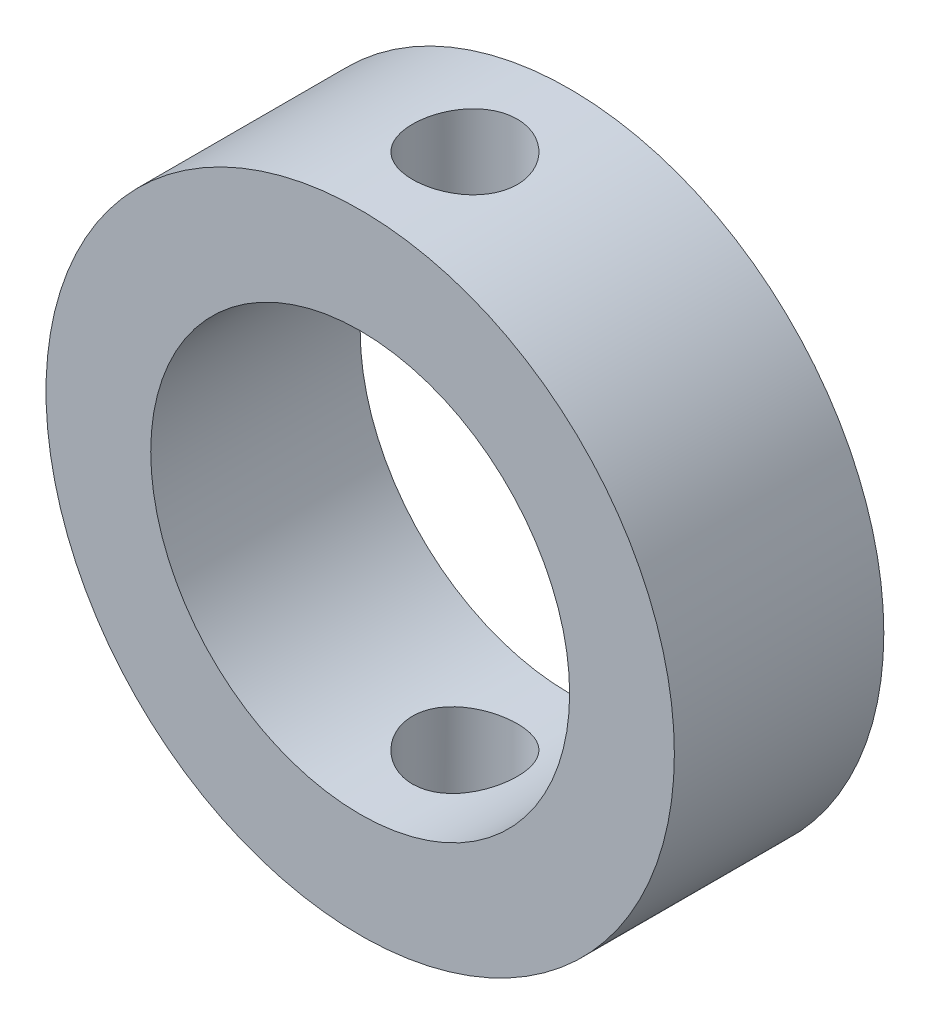
ISO-10303-21;
HEADER;
FILE_DESCRIPTION(('STEP AP214'),'2;1');
FILE_NAME('part.step','',(''),(''),'','','');
FILE_SCHEMA(('AUTOMOTIVE_DESIGN { 1 0 10303 214 1 1 1 1 }'));
ENDSEC;
DATA;
#1=APPLICATION_CONTEXT('core data for automotive mechanical design processes');
#2=APPLICATION_PROTOCOL_DEFINITION('international standard','automotive_design',2000,#1);
#3=PRODUCT_CONTEXT('',#1,'mechanical');
#4=PRODUCT('Part','Part','',(#3));
#5=PRODUCT_RELATED_PRODUCT_CATEGORY('part','',(#4));
#6=PRODUCT_DEFINITION_FORMATION('','',#4);
#7=PRODUCT_DEFINITION_CONTEXT('part definition',#1,'design');
#8=PRODUCT_DEFINITION('design','',#6,#7);
#9=PRODUCT_DEFINITION_SHAPE('','',#8);
#10=(LENGTH_UNIT() NAMED_UNIT(*) SI_UNIT(.MILLI.,.METRE.));
#11=(NAMED_UNIT(*) PLANE_ANGLE_UNIT() SI_UNIT($,.RADIAN.));
#12=(NAMED_UNIT(*) SI_UNIT($,.STERADIAN.) SOLID_ANGLE_UNIT());
#13=UNCERTAINTY_MEASURE_WITH_UNIT(LENGTH_MEASURE(1.E-05),#10,'distance_accuracy_value','');
#14=(GEOMETRIC_REPRESENTATION_CONTEXT(3) GLOBAL_UNCERTAINTY_ASSIGNED_CONTEXT((#13)) GLOBAL_UNIT_ASSIGNED_CONTEXT((#10,
#11,#12)) REPRESENTATION_CONTEXT('',''));
#15=CARTESIAN_POINT('',(0.,0.,0.));
#16=DIRECTION('',(0.,0.,1.));
#17=DIRECTION('',(1.,0.,0.));
#18=AXIS2_PLACEMENT_3D('',#15,#16,#17);
#19=CARTESIAN_POINT('',(0.,0.,10.));
#20=DIRECTION('',(0.,0.,0.999999999999995));
#21=DIRECTION('',(0.999999999999995,0.,0.));
#22=AXIS2_PLACEMENT_3D('',#19,#20,#21);
#23=PLANE('',#22);
#24=CARTESIAN_POINT('',(0.,0.,10.));
#25=DIRECTION('',(0.,0.,0.999999999999995));
#26=DIRECTION('',(0.999999999999995,0.,0.));
#27=AXIS2_PLACEMENT_3D('',#24,#25,#26);
#28=CIRCLE('',#27,15.);
#29=CARTESIAN_POINT('',(14.9999999999999,0.,10.));
#30=VERTEX_POINT('',#29);
#31=EDGE_CURVE('E12',#30,#30,#28,.T.);
#32=ORIENTED_EDGE('',*,*,#31,.T.);
#33=EDGE_LOOP('',(#32));
#34=FACE_BOUND('',#33,.T.);
#35=CARTESIAN_POINT('',(0.,0.,10.));
#36=DIRECTION('',(0.,0.,0.999999999999995));
#37=DIRECTION('',(0.999999999999995,0.,0.));
#38=AXIS2_PLACEMENT_3D('',#35,#36,#37);
#39=CIRCLE('',#38,10.);
#40=CARTESIAN_POINT('',(9.99999999999995,0.,10.));
#41=VERTEX_POINT('',#40);
#42=EDGE_CURVE('E70',#41,#41,#39,.T.);
#43=ORIENTED_EDGE('',*,*,#42,.F.);
#44=EDGE_LOOP('',(#43));
#45=FACE_BOUND('',#44,.T.);
#46=ADVANCED_FACE('F51',(#34,#45),#23,.T.);
#47=CARTESIAN_POINT('',(0.,0.,0.));
#48=DIRECTION('',(0.,0.,0.999999999999995));
#49=DIRECTION('',(0.999999999999995,0.,0.));
#50=AXIS2_PLACEMENT_3D('',#47,#48,#49);
#51=PLANE('',#50);
#52=CARTESIAN_POINT('',(0.,0.,0.));
#53=DIRECTION('',(0.,0.,0.999999999999995));
#54=DIRECTION('',(0.999999999999995,0.,0.));
#55=AXIS2_PLACEMENT_3D('',#52,#53,#54);
#56=CIRCLE('',#55,15.);
#57=CARTESIAN_POINT('',(14.9999999999999,0.,0.));
#58=VERTEX_POINT('',#57);
#59=EDGE_CURVE('E65',#58,#58,#56,.T.);
#60=ORIENTED_EDGE('',*,*,#59,.F.);
#61=EDGE_LOOP('',(#60));
#62=FACE_BOUND('',#61,.T.);
#63=CARTESIAN_POINT('',(0.,0.,0.));
#64=DIRECTION('',(0.,0.,0.999999999999995));
#65=DIRECTION('',(0.999999999999995,0.,0.));
#66=AXIS2_PLACEMENT_3D('',#63,#64,#65);
#67=CIRCLE('',#66,10.);
#68=CARTESIAN_POINT('',(9.99999999999995,0.,0.));
#69=VERTEX_POINT('',#68);
#70=EDGE_CURVE('E73',#69,#69,#67,.T.);
#71=ORIENTED_EDGE('',*,*,#70,.T.);
#72=EDGE_LOOP('',(#71));
#73=FACE_BOUND('',#72,.T.);
#74=ADVANCED_FACE('F109',(#62,#73),#51,.F.);
#75=CARTESIAN_POINT('',(0.,0.,10.));
#76=DIRECTION('',(0.,0.,-0.999999999999995));
#77=DIRECTION('',(-0.999999999999995,0.,0.));
#78=AXIS2_PLACEMENT_3D('',#75,#76,#77);
#79=CYLINDRICAL_SURFACE('',#78,15.);
#80=CARTESIAN_POINT('',(-1.66533453693773E-13,-15.0000000000001,7.50000000000001));
#81=CARTESIAN_POINT('',(0.139390904958074,-14.9999976116884,7.49999441105218));
#82=CARTESIAN_POINT('',(0.278857881838701,-14.9980367791304,7.48830272503107));
#83=CARTESIAN_POINT('',(0.553880221672985,-14.9904034494138,7.44186434123467));
#84=CARTESIAN_POINT('',(0.68943186795923,-14.9847275392389,7.40709644308843));
#85=CARTESIAN_POINT('',(0.952604747212633,-14.9703006823645,7.31558455140724));
#86=CARTESIAN_POINT('',(1.08023236843186,-14.9615522515919,7.25885853435936));
#87=CARTESIAN_POINT('',(1.32414184197791,-14.9419422708207,7.12508770794754));
#88=CARTESIAN_POINT('',(1.4404249898786,-14.9310809625444,7.04804522251701));
#89=CARTESIAN_POINT('',(1.65947261429166,-14.9083331745831,6.87504491617955));
#90=CARTESIAN_POINT('',(1.76211290353487,-14.8964387181486,6.77893088536382));
#91=CARTESIAN_POINT('',(1.9498884986598,-14.8730262687674,6.57085203152713));
#92=CARTESIAN_POINT('',(2.03502269939089,-14.8615082996268,6.45888620854337));
#93=CARTESIAN_POINT('',(2.18586712560504,-14.8400756575979,6.22142903380295));
#94=CARTESIAN_POINT('',(2.25145455286084,-14.8301712909164,6.09585866319523));
#95=CARTESIAN_POINT('',(2.36055836541107,-14.8131978979468,5.83529043569935));
#96=CARTESIAN_POINT('',(2.40407624156555,-14.8061286801433,5.70029321632236));
#97=CARTESIAN_POINT('',(2.46741437778472,-14.7957053684277,5.42601972514346));
#98=CARTESIAN_POINT('',(2.48744902913521,-14.792317684857,5.2867942634986));
#99=CARTESIAN_POINT('',(2.50391672528974,-14.7895393893665,5.00691972311652));
#100=CARTESIAN_POINT('',(2.50035144038902,-14.7901484945724,4.8662707458327));
#101=CARTESIAN_POINT('',(2.46989509839618,-14.7952642886358,4.58907213872457));
#102=CARTESIAN_POINT('',(2.44324488188965,-14.7997307331892,4.4524951964548));
#103=CARTESIAN_POINT('',(2.36775314040325,-14.8119949521101,4.18577868217089));
#104=CARTESIAN_POINT('',(2.31891085431963,-14.819792840733,4.05563933111145));
#105=CARTESIAN_POINT('',(2.20017724609382,-14.8378847933413,3.8047711765591));
#106=CARTESIAN_POINT('',(2.13018591387956,-14.8481906710734,3.68409059391882));
#107=CARTESIAN_POINT('',(1.97121201755731,-14.87012918415,3.45609559946165));
#108=CARTESIAN_POINT('',(1.88222792065426,-14.8817619265428,3.34878226754505));
#109=CARTESIAN_POINT('',(1.68648221215907,-14.9052202787979,3.14917391419265));
#110=CARTESIAN_POINT('',(1.57951396387307,-14.9170464923165,3.05708148146));
#111=CARTESIAN_POINT('',(1.35153524898158,-14.9394260139672,2.89212223733474));
#112=CARTESIAN_POINT('',(1.2305246919064,-14.9499793138975,2.81925554981677));
#113=CARTESIAN_POINT('',(0.977705916166717,-14.9686389289291,2.69479777286369));
#114=CARTESIAN_POINT('',(0.845888725564643,-14.9767431840745,2.64322458066878));
#115=CARTESIAN_POINT('',(0.575298345602703,-14.9895750301266,2.56300578475408));
#116=CARTESIAN_POINT('',(0.436525739179455,-14.9943029035047,2.5343582630263));
#117=CARTESIAN_POINT('',(0.157709901301623,-14.9998112984268,2.50107864153885));
#118=CARTESIAN_POINT('',(0.0177007371510086,-15.0006375301278,2.49616842819438));
#119=CARTESIAN_POINT('',(-0.261139772889886,-14.9983747442117,2.50976134442812));
#120=CARTESIAN_POINT('',(-0.399971163892031,-14.9952858772412,2.52826357313375));
#121=CARTESIAN_POINT('',(-0.671656175546756,-14.985568269382,2.58792484933545));
#122=CARTESIAN_POINT('',(-0.804540868385379,-14.978961048013,2.62894620839004));
#123=CARTESIAN_POINT('',(-1.06154688486041,-14.9629446445537,2.73233451819948));
#124=CARTESIAN_POINT('',(-1.18566771590966,-14.9535353051205,2.79470266763529));
#125=CARTESIAN_POINT('',(-1.42283068946894,-14.9328451630244,2.93965112469679));
#126=CARTESIAN_POINT('',(-1.5357652509372,-14.9215485588703,3.02240515616716));
#127=CARTESIAN_POINT('',(-1.74624358550274,-14.8983846739189,3.20553731538496));
#128=CARTESIAN_POINT('',(-1.84378623969656,-14.8865173517154,3.30591672327667));
#129=CARTESIAN_POINT('',(-2.02174277965802,-14.8634017523585,3.52269754807144));
#130=CARTESIAN_POINT('',(-2.10196876111384,-14.852161161371,3.63925416551435));
#131=CARTESIAN_POINT('',(-2.24170231029511,-14.8317152977788,3.88435296913846));
#132=CARTESIAN_POINT('',(-2.30121053476983,-14.8225099606602,4.01289477522748));
#133=CARTESIAN_POINT('',(-2.39753833147316,-14.807234536977,4.27778973281215));
#134=CARTESIAN_POINT('',(-2.43445143254807,-14.8011515431106,4.41410809503048));
#135=CARTESIAN_POINT('',(-2.48483545377848,-14.7927771683526,4.69112012922174));
#136=CARTESIAN_POINT('',(-2.49830841194635,-14.7904854578274,4.83181341973205));
#137=CARTESIAN_POINT('',(-2.50137286604753,-14.7899673308403,5.11170516596243));
#138=CARTESIAN_POINT('',(-2.49126013612539,-14.7916905650565,5.25090037857531));
#139=CARTESIAN_POINT('',(-2.44807983895697,-14.7988978145372,5.52557924805077));
#140=CARTESIAN_POINT('',(-2.41501234611248,-14.8043818176121,5.66106291694185));
#141=CARTESIAN_POINT('',(-2.32697448959491,-14.8184735628172,5.92435843729262));
#142=CARTESIAN_POINT('',(-2.27202959060057,-14.8270776721967,6.05217901005609));
#143=CARTESIAN_POINT('',(-2.14182700391605,-14.8464436892221,6.29683566919491));
#144=CARTESIAN_POINT('',(-2.06656830874861,-14.857205703884,6.41367121037213));
#145=CARTESIAN_POINT('',(-1.89681888437218,-14.8798345404563,6.63453558310775));
#146=CARTESIAN_POINT('',(-1.80211056359374,-14.891712955763,6.73839601670035));
#147=CARTESIAN_POINT('',(-1.59660903138032,-14.9151437236084,6.92885160447501));
#148=CARTESIAN_POINT('',(-1.48581211291266,-14.9266960002655,7.01544276863818));
#149=CARTESIAN_POINT('',(-1.25036916964028,-14.9482652964222,7.16944826819993));
#150=CARTESIAN_POINT('',(-1.12563278753287,-14.958271162531,7.23672603931299));
#151=CARTESIAN_POINT('',(-0.866513069379078,-14.9755116760178,7.34926948460997));
#152=CARTESIAN_POINT('',(-0.732139494830105,-14.9827490817749,7.3945570810797));
#153=CARTESIAN_POINT('',(-0.497703310045514,-14.9920579083296,7.45200527412665));
#154=CARTESIAN_POINT('',(-0.399058830298574,-14.9950202727336,7.46997446961597));
#155=CARTESIAN_POINT('',(-0.200289310319957,-14.9989921598612,7.49397373784477));
#156=CARTESIAN_POINT('',(-0.10016429560865,-15.0000017162065,7.50000401613737));
#157=CARTESIAN_POINT('',(-1.66533453693773E-13,-15.0000000000001,7.50000000000001));
#158=B_SPLINE_CURVE_WITH_KNOTS('',3,(#80,#81,#82,#83,#84,#85,#86,#87,#88,#89,#90,#91,#92,#93,
#94,#95,#96,#97,#98,#99,#100,#101,#102,#103,#104,#105,#106,#107,#108,#109,#110,#111,#112,#113,
#114,#115,#116,#117,#118,#119,#120,#121,#122,#123,#124,#125,#126,#127,#128,#129,#130,#131,#132,
#133,#134,#135,#136,#137,#138,#139,#140,#141,#142,#143,#144,#145,#146,#147,#148,#149,#150,#151,
#152,#153,#154,#155,#156,#157),.UNSPECIFIED.,.T.,.F.,(4,2,2,2,2,2,2,2,2,2,2,2,2,2,2,2,2,2,2,2,2,
2,2,2,2,2,2,2,2,2,2,2,2,2,2,2,2,2,4),(0.,0.417806584938589,0.835997545695583,1.25384686702543,
1.67164841267494,2.09302491062343,2.51442800169864,2.93842520823846,3.36239376876188,
3.7824607710343,4.2024980432089,4.61820521760413,5.03392665025389,5.45164556632561,
5.86939820680571,6.29232769911324,6.71525991635845,7.138546889159,7.56179844521144,
7.98007883491392,8.39834313035854,8.81407807006407,9.22983635826056,9.64926825627018,
10.0687306305428,10.4925382200762,10.9163323737594,11.3383602234178,11.7603513778662,
12.1770790952271,12.5938054618814,13.0100481822623,13.4263115502934,13.847513841934,
14.2688133387899,14.6930223160721,15.1168075213008,15.4170424816402,15.7172722727697),.UNSPECIFIED.);
#159=CARTESIAN_POINT('',(-1.66533453693773E-13,-15.0000000000001,7.50000000000001));
#160=VERTEX_POINT('',#159);
#161=EDGE_CURVE('E98',#160,#160,#158,.T.);
#162=ORIENTED_EDGE('',*,*,#161,.T.);
#163=EDGE_LOOP('',(#162));
#164=FACE_BOUND('',#163,.T.);
#165=CARTESIAN_POINT('',(-1.59594559789866E-13,14.9999999999995,7.50000000000001));
#166=CARTESIAN_POINT('',(-0.139390904958377,14.9999976116877,7.49999441105219));
#167=CARTESIAN_POINT('',(-0.27885788183899,14.9980367791303,7.48830272503109));
#168=CARTESIAN_POINT('',(-0.553880221673199,14.9904034494139,7.44186434123468));
#169=CARTESIAN_POINT('',(-0.689431867959383,14.9847275392384,7.4070964430884));
#170=CARTESIAN_POINT('',(-0.95260474721279,14.9703006823639,7.31558455140725));
#171=CARTESIAN_POINT('',(-1.08023236843208,14.9615522515918,7.25885853435943));
#172=CARTESIAN_POINT('',(-1.32414184197813,14.9419422708208,7.1250877079476));
#173=CARTESIAN_POINT('',(-1.44042498987876,14.9310809625442,7.048045222517));
#174=CARTESIAN_POINT('',(-1.65947261429185,14.908333174583,6.87504491617956));
#175=CARTESIAN_POINT('',(-1.76211290353517,14.8964387181487,6.77893088536392));
#176=CARTESIAN_POINT('',(-1.94988849866,14.8730262687672,6.57085203152722));
#177=CARTESIAN_POINT('',(-2.03502269939089,14.8615082996261,6.45888620854338));
#178=CARTESIAN_POINT('',(-2.18586712560508,14.8400756575972,6.22142903380294));
#179=CARTESIAN_POINT('',(-2.25145455286114,14.8301712909162,6.09585866319529));
#180=CARTESIAN_POINT('',(-2.36055836541139,14.8131978979469,5.83529043569943));
#181=CARTESIAN_POINT('',(-2.40407624156563,14.806128680143,5.70029321632238));
#182=CARTESIAN_POINT('',(-2.46741437778483,14.7957053684274,5.42601972514344));
#183=CARTESIAN_POINT('',(-2.48744902913557,14.7923176848569,5.28679426349861));
#184=CARTESIAN_POINT('',(-2.50391672529004,14.7895393893665,5.00691972311655));
#185=CARTESIAN_POINT('',(-2.50035144038899,14.7901484945721,4.86627074583273));
#186=CARTESIAN_POINT('',(-2.46989509839615,14.7952642886355,4.58907213872454));
#187=CARTESIAN_POINT('',(-2.44324488188992,14.7997307331891,4.45249519645472));
#188=CARTESIAN_POINT('',(-2.36775314040361,14.81199495211,4.18577868217083));
#189=CARTESIAN_POINT('',(-2.31891085431976,14.8197928407327,4.05563933111146));
#190=CARTESIAN_POINT('',(-2.20017724609391,14.837884793341,3.80477117655907));
#191=CARTESIAN_POINT('',(-2.13018591387984,14.8481906710734,3.68409059391869));
#192=CARTESIAN_POINT('',(-1.97121201755753,14.8701291841499,3.45609559946154));
#193=CARTESIAN_POINT('',(-1.88222792065424,14.8817619265423,3.34878226754507));
#194=CARTESIAN_POINT('',(-1.68648221215897,14.9052202787974,3.14917391419265));
#195=CARTESIAN_POINT('',(-1.57951396387315,14.9170464923165,3.05708148145983));
#196=CARTESIAN_POINT('',(-1.35153524898169,14.9394260139673,2.89212223733456));
#197=CARTESIAN_POINT('',(-1.23052469190638,14.9499793138971,2.81925554981675));
#198=CARTESIAN_POINT('',(-0.977705916166652,14.9686389289288,2.69479777286373));
#199=CARTESIAN_POINT('',(-0.845888725564671,14.9767431840745,2.64322458066872));
#200=CARTESIAN_POINT('',(-0.575298345602814,14.9895750301266,2.56300578475398));
#201=CARTESIAN_POINT('',(-0.436525739179555,14.9943029035044,2.53435826302627));
#202=CARTESIAN_POINT('',(-0.157709901301725,14.9998112984265,2.50107864153888));
#203=CARTESIAN_POINT('',(-0.0177007371511223,15.0006375301278,2.49616842819441));
#204=CARTESIAN_POINT('',(0.261139772889767,14.9983747442118,2.50976134442812));
#205=CARTESIAN_POINT('',(0.39997116389192,14.995285877241,2.52826357313372));
#206=CARTESIAN_POINT('',(0.671656175546657,14.9855682693818,2.58792484933548));
#207=CARTESIAN_POINT('',(0.804540868385283,14.9789610480131,2.62894620839017));
#208=CARTESIAN_POINT('',(1.06154688486039,14.9629446445536,2.73233451819957));
#209=CARTESIAN_POINT('',(1.18566771590971,14.9535353051202,2.79470266763526));
#210=CARTESIAN_POINT('',(1.42283068946894,14.9328451630241,2.93965112469679));
#211=CARTESIAN_POINT('',(1.53576525093708,14.9215485588703,3.02240515616731));
#212=CARTESIAN_POINT('',(1.74624358550256,14.8983846739189,3.20553731538513));
#213=CARTESIAN_POINT('',(1.84378623969644,14.8865173517151,3.30591672327669));
#214=CARTESIAN_POINT('',(2.02174277965785,14.8634017523581,3.52269754807143));
#215=CARTESIAN_POINT('',(2.10196876111358,14.8521611613711,3.63925416551444));
#216=CARTESIAN_POINT('',(2.24170231029482,14.8317152977788,3.88435296913857));
#217=CARTESIAN_POINT('',(2.30121053476963,14.8225099606596,4.0128947752275));
#218=CARTESIAN_POINT('',(2.39753833147295,14.8072345369765,4.27778973281212));
#219=CARTESIAN_POINT('',(2.43445143254777,14.8011515431106,4.41410809503049));
#220=CARTESIAN_POINT('',(2.48483545377813,14.7927771683527,4.69112012922178));
#221=CARTESIAN_POINT('',(2.49830841194602,14.7904854578268,4.83181341973207));
#222=CARTESIAN_POINT('',(2.50137286604719,14.7899673308397,5.1117051659624));
#223=CARTESIAN_POINT('',(2.491260136125,14.7916905650565,5.25090037857527));
#224=CARTESIAN_POINT('',(2.44807983895671,14.7988978145373,5.52557924805075));
#225=CARTESIAN_POINT('',(2.4150123461124,14.8043818176117,5.66106291694189));
#226=CARTESIAN_POINT('',(2.32697448959482,14.8184735628167,5.92435843729259));
#227=CARTESIAN_POINT('',(2.2720295906003,14.8270776721966,6.05217901005595));
#228=CARTESIAN_POINT('',(2.1418270039158,14.8464436892222,6.29683566919477));
#229=CARTESIAN_POINT('',(2.06656830874855,14.857205703884,6.41367121037213));
#230=CARTESIAN_POINT('',(1.89681888437217,14.8798345404562,6.63453558310775));
#231=CARTESIAN_POINT('',(1.80211056359359,14.8917129557631,6.73839601670019));
#232=CARTESIAN_POINT('',(1.59660903138014,14.9151437236084,6.92885160447486));
#233=CARTESIAN_POINT('',(1.48581211291259,14.9266960002653,7.01544276863817));
#234=CARTESIAN_POINT('',(1.25036916964026,14.948265296422,7.16944826819996));
#235=CARTESIAN_POINT('',(1.12563278753278,14.958271162531,7.23672603931291));
#236=CARTESIAN_POINT('',(0.866513069378945,14.9755116760178,7.34926948460986));
#237=CARTESIAN_POINT('',(0.732139494829996,14.9827490817748,7.39455708107969));
#238=CARTESIAN_POINT('',(0.497703310045376,14.9920579083296,7.45200527412667));
#239=CARTESIAN_POINT('',(0.399058830298395,14.9950202727337,7.46997446961596));
#240=CARTESIAN_POINT('',(0.200289310319703,14.9989921598611,7.49397373784475));
#241=CARTESIAN_POINT('',(0.100164295608363,15.0000017162059,7.50000401613737));
#242=CARTESIAN_POINT('',(-1.59594559789866E-13,14.9999999999995,7.50000000000001));
#243=B_SPLINE_CURVE_WITH_KNOTS('',3,(#165,#166,#167,#168,#169,#170,#171,#172,#173,#174,#175,
#176,#177,#178,#179,#180,#181,#182,#183,#184,#185,#186,#187,#188,#189,#190,#191,#192,#193,#194,
#195,#196,#197,#198,#199,#200,#201,#202,#203,#204,#205,#206,#207,#208,#209,#210,#211,#212,#213,
#214,#215,#216,#217,#218,#219,#220,#221,#222,#223,#224,#225,#226,#227,#228,#229,#230,#231,#232,
#233,#234,#235,#236,#237,#238,#239,#240,#241,#242),.UNSPECIFIED.,.T.,.F.,(4,2,2,2,2,2,2,2,2,2,2,
2,2,2,2,2,2,2,2,2,2,2,2,2,2,2,2,2,2,2,2,2,2,2,2,2,2,2,4),(0.,0.417806584938505,
0.835997545695414,1.25384686702528,1.6716484126748,2.09302491062326,2.51442800169846,
2.93842520823832,3.36239376876174,3.78246077103417,4.2024980432088,4.61820521760404,
5.03392665025379,5.45164556632556,5.86939820680573,6.29232769911329,6.71525991635852,
7.138546889159,7.56179844521138,7.98007883491385,8.39834313035848,8.81407807006409,
9.22983635826064,9.64926825627017,10.0687306305427,10.4925382200761,10.9163323737593,
11.3383602234176,11.760351377866,12.1770790952269,12.5938054618812,13.010048182262,
13.4263115502932,13.8475138419337,14.2688133387895,14.6930223160718,15.1168075213005,
15.41704248164,15.7172722727696),.UNSPECIFIED.);
#244=CARTESIAN_POINT('',(-1.59594559789866E-13,14.9999999999995,7.50000000000001));
#245=VERTEX_POINT('',#244);
#246=EDGE_CURVE('E93',#245,#245,#243,.T.);
#247=ORIENTED_EDGE('',*,*,#246,.T.);
#248=EDGE_LOOP('',(#247));
#249=FACE_BOUND('',#248,.T.);
#250=ORIENTED_EDGE('',*,*,#31,.F.);
#251=EDGE_LOOP('',(#250));
#252=FACE_BOUND('',#251,.T.);
#253=ORIENTED_EDGE('',*,*,#59,.T.);
#254=EDGE_LOOP('',(#253));
#255=FACE_BOUND('',#254,.T.);
#256=ADVANCED_FACE('F53',(#164,#249,#252,#255),#79,.T.);
#257=CARTESIAN_POINT('',(0.,0.,10.));
#258=DIRECTION('',(0.,0.,-0.999999999999995));
#259=DIRECTION('',(-0.999999999999995,0.,0.));
#260=AXIS2_PLACEMENT_3D('',#257,#258,#259);
#261=CYLINDRICAL_SURFACE('',#260,10.);
#262=CARTESIAN_POINT('',(0.,-10.0000000000004,7.50000000000001));
#263=CARTESIAN_POINT('',(0.138126814449501,-9.99999766446733,7.49999612376973));
#264=CARTESIAN_POINT('',(0.276296929717884,-9.99710963553054,7.48851408204367));
#265=CARTESIAN_POINT('',(0.548677206284181,-9.98586856383147,7.44295808115498));
#266=CARTESIAN_POINT('',(0.682885078117876,-9.97751242366632,7.40887131743693));
#267=CARTESIAN_POINT('',(0.943368120304251,-9.95626043886733,7.31926791089653));
#268=CARTESIAN_POINT('',(1.06965260571659,-9.94337004736768,7.26377700214119));
#269=CARTESIAN_POINT('',(1.3111202198406,-9.91442239679367,7.1330310165919));
#270=CARTESIAN_POINT('',(1.42630297391449,-9.89836503090261,7.05777527313505));
#271=CARTESIAN_POINT('',(1.64466987883473,-9.86445689319491,6.88799868390971));
#272=CARTESIAN_POINT('',(1.74759281676827,-9.84657845246879,6.79314737506821));
#273=CARTESIAN_POINT('',(1.9362482120054,-9.81122700196563,6.58757965848492));
#274=CARTESIAN_POINT('',(2.02197872824857,-9.79375403816449,6.47686146175512));
#275=CARTESIAN_POINT('',(2.17504423799818,-9.76091292830284,6.24067462210502));
#276=CARTESIAN_POINT('',(2.24208702654173,-9.74557990774689,6.11501128198542));
#277=CARTESIAN_POINT('',(2.35399484758445,-9.71915824696697,5.85375264723324));
#278=CARTESIAN_POINT('',(2.39886342573356,-9.70806892824033,5.71815894444665));
#279=CARTESIAN_POINT('',(2.46425806134125,-9.6916746116054,5.44376083633059));
#280=CARTESIAN_POINT('',(2.48525378055328,-9.68625818328355,5.30507517327002));
#281=CARTESIAN_POINT('',(2.50376962511049,-9.68148937432658,5.02605238500108));
#282=CARTESIAN_POINT('',(2.50129356969674,-9.68213600713221,4.88571553217977));
#283=CARTESIAN_POINT('',(2.47331087439941,-9.68932009194696,4.61097365375775));
#284=CARTESIAN_POINT('',(2.44836390031756,-9.69571438345483,4.47650729755779));
#285=CARTESIAN_POINT('',(2.37704031150482,-9.71344516118463,4.2137315818149));
#286=CARTESIAN_POINT('',(2.33066217011554,-9.72478199948774,4.08542266161847));
#287=CARTESIAN_POINT('',(2.21731579656186,-9.75125189842804,3.83710330624645));
#288=CARTESIAN_POINT('',(2.15014444538802,-9.76642212449701,3.71718971368405));
#289=CARTESIAN_POINT('',(1.99726046002474,-9.79882851409985,3.49013548373862));
#290=CARTESIAN_POINT('',(1.91154458134795,-9.81606503891073,3.38299708655456));
#291=CARTESIAN_POINT('',(1.72110570780195,-9.85126467566515,3.18132730717599));
#292=CARTESIAN_POINT('',(1.6159104302763,-9.86923449130008,3.08724251656445));
#293=CARTESIAN_POINT('',(1.39101986250604,-9.90343275964591,2.91796459589353));
#294=CARTESIAN_POINT('',(1.27132412951317,-9.91966115915691,2.84277204289407));
#295=CARTESIAN_POINT('',(1.02019314780228,-9.94862886823666,2.71324902295937));
#296=CARTESIAN_POINT('',(0.88871898868099,-9.96135600212883,2.658991099576));
#297=CARTESIAN_POINT('',(0.6181266802381,-9.98179861652357,2.57347115715075));
#298=CARTESIAN_POINT('',(0.479009998584128,-9.98951505565467,2.54220473930311));
#299=CARTESIAN_POINT('',(0.200899950650052,-9.99892498785625,2.50423739073525));
#300=CARTESIAN_POINT('',(0.0619945333136857,-10.0007675584713,2.49692828987448));
#301=CARTESIAN_POINT('',(-0.215054791335847,-9.99864674690754,2.50541500342582));
#302=CARTESIAN_POINT('',(-0.353198766074324,-9.99468388736422,2.52120873799859));
#303=CARTESIAN_POINT('',(-0.622690447960835,-9.98149301878918,2.57495151398563));
#304=CARTESIAN_POINT('',(-0.754108531614624,-9.97234390309646,2.61256877246158));
#305=CARTESIAN_POINT('',(-1.00876215408757,-9.94981177723595,2.70851180671406));
#306=CARTESIAN_POINT('',(-1.13199686505445,-9.93642833949967,2.76683967385537));
#307=CARTESIAN_POINT('',(-1.36920522404977,-9.90655513210371,2.90372688145778));
#308=CARTESIAN_POINT('',(-1.48297573639304,-9.89001445610998,2.9826268539942));
#309=CARTESIAN_POINT('',(-1.69587768940558,-9.85574181979585,3.15798318132855));
#310=CARTESIAN_POINT('',(-1.79500659828873,-9.83800965421579,3.25444256602942));
#311=CARTESIAN_POINT('',(-1.97831761345416,-9.80281594932497,3.46500326807286));
#312=CARTESIAN_POINT('',(-2.06207311270197,-9.7853717363746,3.57947950499921));
#313=CARTESIAN_POINT('',(-2.20918459835616,-9.75321463970068,3.82122105744756));
#314=CARTESIAN_POINT('',(-2.272541490269,-9.73850163474945,3.94848580495073));
#315=CARTESIAN_POINT('',(-2.37658570101225,-9.71363491194661,4.21150953734373));
#316=CARTESIAN_POINT('',(-2.41740732773948,-9.70345425375791,4.34721271385378));
#317=CARTESIAN_POINT('',(-2.47557609990502,-9.68877906706595,4.62384939642543));
#318=CARTESIAN_POINT('',(-2.49292837912645,-9.68428329504095,4.76478175170239));
#319=CARTESIAN_POINT('',(-2.50339765056077,-9.6815816870166,5.04353503976938));
#320=CARTESIAN_POINT('',(-2.49719649630144,-9.6831988788804,5.18132905854412));
#321=CARTESIAN_POINT('',(-2.46229546385386,-9.69213181672129,5.4538398144438));
#322=CARTESIAN_POINT('',(-2.43359603781106,-9.6994474481774,5.58855661335532));
#323=CARTESIAN_POINT('',(-2.354885532405,-9.71885434473235,5.85034743177645));
#324=CARTESIAN_POINT('',(-2.30500234113417,-9.73091692061053,5.9774621754006));
#325=CARTESIAN_POINT('',(-2.1854415226752,-9.75846259540837,6.22160897118933));
#326=CARTESIAN_POINT('',(-2.11576115005707,-9.77394616867823,6.33863962197814));
#327=CARTESIAN_POINT('',(-1.95644624772867,-9.80709390439355,6.56259104833677));
#328=CARTESIAN_POINT('',(-1.86633860485388,-9.82480441386304,6.66916845570667));
#329=CARTESIAN_POINT('',(-1.66964895198299,-9.86013378743763,6.86591174132572));
#330=CARTESIAN_POINT('',(-1.56306303543531,-9.87775262878423,6.95607371685495));
#331=CARTESIAN_POINT('',(-1.33411264450436,-9.91129426079448,7.1190188476077));
#332=CARTESIAN_POINT('',(-1.21149737052736,-9.92718055609771,7.1914576894527));
#333=CARTESIAN_POINT('',(-0.955443432517495,-9.95508208291873,7.31457910490095));
#334=CARTESIAN_POINT('',(-0.822012605727919,-9.96710008666348,7.36527726774756));
#335=CARTESIAN_POINT('',(-0.574017088739124,-9.98413432609269,7.43595305054941));
#336=CARTESIAN_POINT('',(-0.460633618180121,-9.99004308421151,7.45991873842241));
#337=CARTESIAN_POINT('',(-0.231510119227161,-9.99797675386581,7.49194323936994));
#338=CARTESIAN_POINT('',(-0.115770268737728,-10.0000019575153,7.50000324884219));
#339=CARTESIAN_POINT('',(0.,-10.0000000000004,7.50000000000001));
#340=B_SPLINE_CURVE_WITH_KNOTS('',3,(#262,#263,#264,#265,#266,#267,#268,#269,#270,#271,#272,
#273,#274,#275,#276,#277,#278,#279,#280,#281,#282,#283,#284,#285,#286,#287,#288,#289,#290,#291,
#292,#293,#294,#295,#296,#297,#298,#299,#300,#301,#302,#303,#304,#305,#306,#307,#308,#309,#310,
#311,#312,#313,#314,#315,#316,#317,#318,#319,#320,#321,#322,#323,#324,#325,#326,#327,#328,#329,
#330,#331,#332,#333,#334,#335,#336,#337,#338,#339),.UNSPECIFIED.,.T.,.F.,(4,2,2,2,2,2,2,2,2,2,2,
2,2,2,2,2,2,2,2,2,2,2,2,2,2,2,2,2,2,2,2,2,2,2,2,2,2,2,4),(0.,0.41395618745316,0.828147062939856,
1.24184150381015,1.65554990028214,2.07690725728558,2.49831215966764,2.92597745909673,
3.35357435282276,3.77260491835111,4.19156730193356,4.60037495017226,5.00921172448929,
5.42217546461996,5.83521151399134,6.26002501620557,6.68485149269266,7.11113715020708,
7.53734122819919,7.95263848254308,8.3678983519342,8.77700457528913,9.18615212209337,
9.60255979281105,10.0190393835222,10.4457418201298,10.872425312547,11.2965375769762,
11.7205570543046,12.1323963400747,12.5442273493651,12.9536066760886,13.3630428023795,
13.7831596069297,14.2033761629382,14.6312030917577,15.0587227304538,15.4057040491338,
15.7526592674819),.UNSPECIFIED.);
#341=CARTESIAN_POINT('',(0.,-10.0000000000004,7.50000000000001));
#342=VERTEX_POINT('',#341);
#343=EDGE_CURVE('E56',#342,#342,#340,.T.);
#344=ORIENTED_EDGE('',*,*,#343,.F.);
#345=EDGE_LOOP('',(#344));
#346=FACE_BOUND('',#345,.T.);
#347=CARTESIAN_POINT('',(0.,10.,7.50000000000001));
#348=CARTESIAN_POINT('',(-0.138126814449567,9.99999766446689,7.49999612376976));
#349=CARTESIAN_POINT('',(-0.276296929717974,9.99710963553048,7.48851408204372));
#350=CARTESIAN_POINT('',(-0.548677206284275,9.98586856383153,7.44295808115501));
#351=CARTESIAN_POINT('',(-0.682885078117951,9.97751242366611,7.40887131743692));
#352=CARTESIAN_POINT('',(-0.943368120304364,9.95626043886704,7.31926791089654));
#353=CARTESIAN_POINT('',(-1.06965260571676,9.9433700473676,7.26377700214128));
#354=CARTESIAN_POINT('',(-1.31112021984076,9.91442239679372,7.13303101659198));
#355=CARTESIAN_POINT('',(-1.4263029739146,9.89836503090259,7.05777527313505));
#356=CARTESIAN_POINT('',(-1.64466987883488,9.86445689319487,6.8879986839097));
#357=CARTESIAN_POINT('',(-1.74759281676853,9.84657845246881,6.7931473750683));
#358=CARTESIAN_POINT('',(-1.93624821200564,9.81122700196552,6.58757965848502));
#359=CARTESIAN_POINT('',(-2.02197872824869,9.79375403816419,6.47686146175513));
#360=CARTESIAN_POINT('',(-2.17504423799834,9.76091292830259,6.24067462210501));
#361=CARTESIAN_POINT('',(-2.24208702654204,9.74557990774686,6.11501128198546));
#362=CARTESIAN_POINT('',(-2.35399484758476,9.71915824696685,5.8537526472333));
#363=CARTESIAN_POINT('',(-2.3988634257337,9.70806892823989,5.71815894444666));
#364=CARTESIAN_POINT('',(-2.4642580613414,9.69167461160501,5.44376083633057));
#365=CARTESIAN_POINT('',(-2.48525378055358,9.6862581832835,5.30507517327001));
#366=CARTESIAN_POINT('',(-2.50376962511086,9.68148937432645,5.02605238500109));
#367=CARTESIAN_POINT('',(-2.50129356969702,9.68213600713165,4.88571553217977));
#368=CARTESIAN_POINT('',(-2.47331087439969,9.68932009194641,4.61097365375774));
#369=CARTESIAN_POINT('',(-2.44836390031793,9.69571438345471,4.47650729755777));
#370=CARTESIAN_POINT('',(-2.37704031150512,9.71344516118458,4.2137315818149));
#371=CARTESIAN_POINT('',(-2.33066217011568,9.72478199948734,4.08542266161849));
#372=CARTESIAN_POINT('',(-2.21731579656199,9.75125189842761,3.83710330624644));
#373=CARTESIAN_POINT('',(-2.1501444453883,9.76642212449691,3.71718971368398));
#374=CARTESIAN_POINT('',(-1.99726046002504,9.79882851409983,3.49013548373856));
#375=CARTESIAN_POINT('',(-1.91154458134813,9.81606503891044,3.38299708655456));
#376=CARTESIAN_POINT('',(-1.72110570780208,9.85126467566483,3.18132730717598));
#377=CARTESIAN_POINT('',(-1.61591043027652,9.8692344913,3.08724251656435));
#378=CARTESIAN_POINT('',(-1.39101986250624,9.90343275964593,2.91796459589344));
#379=CARTESIAN_POINT('',(-1.27132412951326,9.91966115915678,2.84277204289407));
#380=CARTESIAN_POINT('',(-1.02019314780231,9.9486288682365,2.71324902295938));
#381=CARTESIAN_POINT('',(-0.888718988681051,9.9613560021288,2.65899109957592));
#382=CARTESIAN_POINT('',(-0.618126680238164,9.98179861652359,2.57347115715066));
#383=CARTESIAN_POINT('',(-0.479009998584159,9.98951505565462,2.54220473930308));
#384=CARTESIAN_POINT('',(-0.20089995065006,9.99892498785625,2.50423739073528));
#385=CARTESIAN_POINT('',(-0.061994533313702,10.0007675584714,2.49692828987451));
#386=CARTESIAN_POINT('',(0.215054791335826,9.99864674690744,2.50541500342582));
#387=CARTESIAN_POINT('',(0.353198766074307,9.99468388736383,2.52120873799855));
#388=CARTESIAN_POINT('',(0.622690447960801,9.9814930187888,2.57495151398566));
#389=CARTESIAN_POINT('',(0.754108531614569,9.97234390309638,2.6125687724617));
#390=CARTESIAN_POINT('',(1.00876215408753,9.94981177723605,2.70851180671416));
#391=CARTESIAN_POINT('',(1.13199686505444,9.93642833949963,2.76683967385536));
#392=CARTESIAN_POINT('',(1.3692052240497,9.90655513210369,2.90372688145779));
#393=CARTESIAN_POINT('',(1.48297573639288,9.8900144561101,2.98262685399435));
#394=CARTESIAN_POINT('',(1.69587768940542,9.85574181979578,3.15798318132869));
#395=CARTESIAN_POINT('',(1.79500659828866,9.83800965421539,3.25444256602942));
#396=CARTESIAN_POINT('',(1.97831761345403,9.80281594932465,3.46500326807287));
#397=CARTESIAN_POINT('',(2.06207311270168,9.7853717363747,3.57947950499939));
#398=CARTESIAN_POINT('',(2.209184598356,9.75321463970067,3.82122105744774));
#399=CARTESIAN_POINT('',(2.27254149026911,9.73850163474891,3.94848580495074));
#400=CARTESIAN_POINT('',(2.37658570101228,9.7136349119462,4.2115095373437));
#401=CARTESIAN_POINT('',(2.41740732773916,9.70345425375815,4.34721271385388));
#402=CARTESIAN_POINT('',(2.47557609990474,9.68877906706587,4.62384939642558));
#403=CARTESIAN_POINT('',(2.49292837912657,9.6842832950399,4.76478175170245));
#404=CARTESIAN_POINT('',(2.50339765056088,9.68158168701554,5.04353503976932));
#405=CARTESIAN_POINT('',(2.49719649630118,9.68319887888027,5.18132905854404));
#406=CARTESIAN_POINT('',(2.46229546385347,9.69213181672159,5.45383981444376));
#407=CARTESIAN_POINT('',(2.43359603781093,9.69944744817722,5.58855661335534));
#408=CARTESIAN_POINT('',(2.35488553240493,9.71885434473204,5.85034743177643));
#409=CARTESIAN_POINT('',(2.3050023411339,9.73091692061057,5.97746217540048));
#410=CARTESIAN_POINT('',(2.18544152267491,9.75846259540846,6.22160897118922));
#411=CARTESIAN_POINT('',(2.11576115005694,9.77394616867803,6.33863962197815));
#412=CARTESIAN_POINT('',(1.95644624772861,9.80709390439337,6.56259104833674));
#413=CARTESIAN_POINT('',(1.86633860485373,9.82480441386318,6.66916845570649));
#414=CARTESIAN_POINT('',(1.66964895198283,9.86013378743755,6.86591174132555));
#415=CARTESIAN_POINT('',(1.56306303543524,9.87775262878362,6.95607371685495));
#416=CARTESIAN_POINT('',(1.33411264450435,9.91129426079387,7.11901884760771));
#417=CARTESIAN_POINT('',(1.21149737052732,9.92718055609766,7.19145768945257));
#418=CARTESIAN_POINT('',(0.955443432517457,9.95508208291877,7.31457910490079));
#419=CARTESIAN_POINT('',(0.8220126057279,9.96710008666306,7.36527726774754));
#420=CARTESIAN_POINT('',(0.574017088739117,9.98413432609233,7.43595305054943));
#421=CARTESIAN_POINT('',(0.460633618180109,9.9900430842115,7.45991873842238));
#422=CARTESIAN_POINT('',(0.231510119227134,9.99797675386581,7.49194323936988));
#423=CARTESIAN_POINT('',(0.115770268737693,10.0000019575149,7.50000324884216));
#424=CARTESIAN_POINT('',(0.,10.,7.50000000000001));
#425=B_SPLINE_CURVE_WITH_KNOTS('',3,(#347,#348,#349,#350,#351,#352,#353,#354,#355,#356,#357,
#358,#359,#360,#361,#362,#363,#364,#365,#366,#367,#368,#369,#370,#371,#372,#373,#374,#375,#376,
#377,#378,#379,#380,#381,#382,#383,#384,#385,#386,#387,#388,#389,#390,#391,#392,#393,#394,#395,
#396,#397,#398,#399,#400,#401,#402,#403,#404,#405,#406,#407,#408,#409,#410,#411,#412,#413,#414,
#415,#416,#417,#418,#419,#420,#421,#422,#423,#424),.UNSPECIFIED.,.T.,.F.,(4,2,2,2,2,2,2,2,2,2,2,
2,2,2,2,2,2,2,2,2,2,2,2,2,2,2,2,2,2,2,2,2,2,2,2,2,2,2,4),(0.,0.413956187453193,
0.828147062939918,1.24184150381023,1.65554990028222,2.0769072572857,2.49831215966779,
2.92597745909689,3.35357435282295,3.77260491835131,4.19156730193376,4.60037495017248,
5.00921172448954,5.42217546462023,5.83521151399161,6.2600250162059,6.68485149269306,
7.11113715020752,7.53734122819965,7.95263848254354,8.36789835193467,8.77700457528958,
9.18615212209377,9.60255979281143,10.0190393835225,10.4457418201302,10.8724253125474,
11.2965375769766,11.720557054305,12.1323963400751,12.5442273493654,12.9536066760889,
13.3630428023798,13.7831596069299,14.2033761629383,14.6312030917579,15.0587227304539,
15.4057040491339,15.7526592674821),.UNSPECIFIED.);
#426=CARTESIAN_POINT('',(0.,10.,7.50000000000001));
#427=VERTEX_POINT('',#426);
#428=EDGE_CURVE('E75',#427,#427,#425,.T.);
#429=ORIENTED_EDGE('',*,*,#428,.F.);
#430=EDGE_LOOP('',(#429));
#431=FACE_BOUND('',#430,.T.);
#432=ORIENTED_EDGE('',*,*,#42,.T.);
#433=EDGE_LOOP('',(#432));
#434=FACE_BOUND('',#433,.T.);
#435=ORIENTED_EDGE('',*,*,#70,.F.);
#436=EDGE_LOOP('',(#435));
#437=FACE_BOUND('',#436,.T.);
#438=ADVANCED_FACE('F80',(#346,#431,#434,#437),#261,.F.);
#439=CARTESIAN_POINT('',(-1.66533453693773E-13,-15.0000000000001,5.));
#440=DIRECTION('',(0.,0.999999999999995,0.));
#441=DIRECTION('',(0.,0.,0.999999999999995));
#442=AXIS2_PLACEMENT_3D('',#439,#440,#441);
#443=CYLINDRICAL_SURFACE('',#442,2.5);
#444=ORIENTED_EDGE('',*,*,#428,.T.);
#445=EDGE_LOOP('',(#444));
#446=FACE_BOUND('',#445,.T.);
#447=ORIENTED_EDGE('',*,*,#246,.F.);
#448=EDGE_LOOP('',(#447));
#449=FACE_BOUND('',#448,.T.);
#450=ADVANCED_FACE('F86',(#446,#449),#443,.F.);
#451=ORIENTED_EDGE('',*,*,#343,.T.);
#452=EDGE_LOOP('',(#451));
#453=FACE_BOUND('',#452,.T.);
#454=ORIENTED_EDGE('',*,*,#161,.F.);
#455=EDGE_LOOP('',(#454));
#456=FACE_BOUND('',#455,.T.);
#457=ADVANCED_FACE('F83',(#453,#456),#443,.F.);
#458=CLOSED_SHELL('',(#46,#74,#256,#438,#450,#457));
#459=MANIFOLD_SOLID_BREP('B2',#458);
#460=ADVANCED_BREP_SHAPE_REPRESENTATION('',(#18,#459),#14);
#461=SHAPE_DEFINITION_REPRESENTATION(#9,#460);
ENDSEC;
END-ISO-10303-21;
